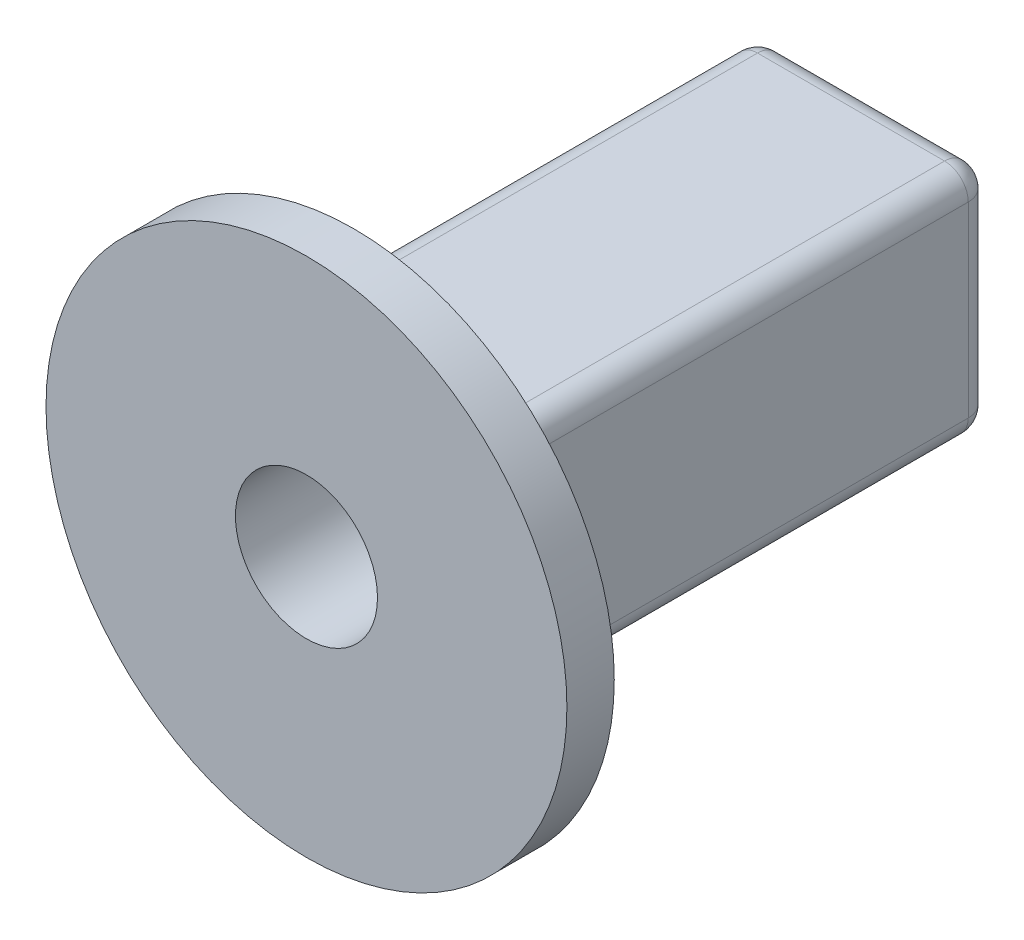
ISO-10303-21;
HEADER;
FILE_DESCRIPTION(('STEP AP214'),'2;1');
FILE_NAME('part.step','',(''),(''),'','','');
FILE_SCHEMA(('AUTOMOTIVE_DESIGN { 1 0 10303 214 1 1 1 1 }'));
ENDSEC;
DATA;
#1=APPLICATION_CONTEXT('core data for automotive mechanical design processes');
#2=APPLICATION_PROTOCOL_DEFINITION('international standard','automotive_design',2000,#1);
#3=PRODUCT_CONTEXT('',#1,'mechanical');
#4=PRODUCT('Part','Part','',(#3));
#5=PRODUCT_RELATED_PRODUCT_CATEGORY('part','',(#4));
#6=PRODUCT_DEFINITION_FORMATION('','',#4);
#7=PRODUCT_DEFINITION_CONTEXT('part definition',#1,'design');
#8=PRODUCT_DEFINITION('design','',#6,#7);
#9=PRODUCT_DEFINITION_SHAPE('','',#8);
#10=(LENGTH_UNIT() NAMED_UNIT(*) SI_UNIT(.MILLI.,.METRE.));
#11=(NAMED_UNIT(*) PLANE_ANGLE_UNIT() SI_UNIT($,.RADIAN.));
#12=(NAMED_UNIT(*) SI_UNIT($,.STERADIAN.) SOLID_ANGLE_UNIT());
#13=UNCERTAINTY_MEASURE_WITH_UNIT(LENGTH_MEASURE(1.E-05),#10,'distance_accuracy_value','');
#14=(GEOMETRIC_REPRESENTATION_CONTEXT(3) GLOBAL_UNCERTAINTY_ASSIGNED_CONTEXT((#13)) GLOBAL_UNIT_ASSIGNED_CONTEXT((#10,
#11,#12)) REPRESENTATION_CONTEXT('',''));
#15=CARTESIAN_POINT('',(0.,0.,0.));
#16=DIRECTION('',(0.,0.,1.));
#17=DIRECTION('',(1.,0.,0.));
#18=AXIS2_PLACEMENT_3D('',#15,#16,#17);
#19=CARTESIAN_POINT('',(-2.47487373415292,2.4748737341529,11.));
#20=DIRECTION('',(1.,0.,0.));
#21=DIRECTION('',(0.,1.,0.));
#22=AXIS2_PLACEMENT_3D('',#19,#20,#21);
#23=PLANE('',#22);
#24=DIRECTION('',(0.,-1.,0.));
#25=VECTOR('',#24,1.);
#26=CARTESIAN_POINT('',(-2.47487373415292,2.4748737341529,0.5));
#27=LINE('',#26,#25);
#28=CARTESIAN_POINT('',(-2.47487373415292,1.9748737341529,0.5));
#29=VERTEX_POINT('',#28);
#30=CARTESIAN_POINT('',(-2.47487373415292,-1.97487373415294,0.5));
#31=VERTEX_POINT('',#30);
#32=EDGE_CURVE('E47',#29,#31,#27,.T.);
#33=ORIENTED_EDGE('',*,*,#32,.T.);
#34=DIRECTION('',(0.,0.,-1.));
#35=VECTOR('',#34,1.);
#36=CARTESIAN_POINT('',(-2.47487373415292,-1.97487373415294,11.));
#37=LINE('',#36,#35);
#38=CARTESIAN_POINT('',(-2.47487373415292,-1.97487373415294,11.));
#39=VERTEX_POINT('',#38);
#40=EDGE_CURVE('E119',#31,#39,#37,.F.);
#41=ORIENTED_EDGE('',*,*,#40,.T.);
#42=DIRECTION('',(0.,-1.,0.));
#43=VECTOR('',#42,1.);
#44=CARTESIAN_POINT('',(-2.47487373415292,2.4748737341529,11.));
#45=LINE('',#44,#43);
#46=CARTESIAN_POINT('',(-2.47487373415292,1.9748737341529,11.));
#47=VERTEX_POINT('',#46);
#48=EDGE_CURVE('E210',#47,#39,#45,.T.);
#49=ORIENTED_EDGE('',*,*,#48,.F.);
#50=DIRECTION('',(0.,0.,-1.));
#51=VECTOR('',#50,1.);
#52=CARTESIAN_POINT('',(-2.47487373415292,1.9748737341529,11.));
#53=LINE('',#52,#51);
#54=EDGE_CURVE('E52',#47,#29,#53,.T.);
#55=ORIENTED_EDGE('',*,*,#54,.T.);
#56=EDGE_LOOP('',(#33,#41,#49,#55));
#57=FACE_BOUND('',#56,.T.);
#58=ADVANCED_FACE('F30',(#57),#23,.F.);
#59=CARTESIAN_POINT('',(-2.47487373415292,-2.47487373415294,11.));
#60=DIRECTION('',(0.,1.,0.));
#61=DIRECTION('',(0.,0.,1.));
#62=AXIS2_PLACEMENT_3D('',#59,#60,#61);
#63=PLANE('',#62);
#64=DIRECTION('',(1.,0.,0.));
#65=VECTOR('',#64,1.);
#66=CARTESIAN_POINT('',(-2.47487373415292,-2.47487373415294,11.));
#67=LINE('',#66,#65);
#68=CARTESIAN_POINT('',(-1.97487373415292,-2.47487373415294,11.));
#69=VERTEX_POINT('',#68);
#70=CARTESIAN_POINT('',(1.97487373415292,-2.47487373415294,11.));
#71=VERTEX_POINT('',#70);
#72=EDGE_CURVE('E215',#69,#71,#67,.T.);
#73=ORIENTED_EDGE('',*,*,#72,.F.);
#74=DIRECTION('',(0.,0.,-1.));
#75=VECTOR('',#74,1.);
#76=CARTESIAN_POINT('',(-1.97487373415292,-2.47487373415294,11.));
#77=LINE('',#76,#75);
#78=CARTESIAN_POINT('',(-1.97487373415292,-2.47487373415294,0.5));
#79=VERTEX_POINT('',#78);
#80=EDGE_CURVE('E156',#69,#79,#77,.T.);
#81=ORIENTED_EDGE('',*,*,#80,.T.);
#82=DIRECTION('',(1.,0.,0.));
#83=VECTOR('',#82,1.);
#84=CARTESIAN_POINT('',(-2.47487373415292,-2.47487373415294,0.5));
#85=LINE('',#84,#83);
#86=CARTESIAN_POINT('',(1.97487373415292,-2.47487373415294,0.5));
#87=VERTEX_POINT('',#86);
#88=EDGE_CURVE('E154',#79,#87,#85,.T.);
#89=ORIENTED_EDGE('',*,*,#88,.T.);
#90=DIRECTION('',(0.,0.,-1.));
#91=VECTOR('',#90,1.);
#92=CARTESIAN_POINT('',(1.97487373415292,-2.47487373415294,11.));
#93=LINE('',#92,#91);
#94=EDGE_CURVE('E152',#87,#71,#93,.F.);
#95=ORIENTED_EDGE('',*,*,#94,.T.);
#96=EDGE_LOOP('',(#73,#81,#89,#95));
#97=FACE_BOUND('',#96,.T.);
#98=ADVANCED_FACE('F267',(#97),#63,.F.);
#99=CARTESIAN_POINT('',(2.47487373415292,2.4748737341529,11.));
#100=DIRECTION('',(-1.,0.,0.));
#101=DIRECTION('',(0.,-1.,0.));
#102=AXIS2_PLACEMENT_3D('',#99,#100,#101);
#103=PLANE('',#102);
#104=DIRECTION('',(0.,1.,0.));
#105=VECTOR('',#104,1.);
#106=CARTESIAN_POINT('',(2.47487373415292,2.4748737341529,0.5));
#107=LINE('',#106,#105);
#108=CARTESIAN_POINT('',(2.47487373415292,-1.97487373415294,0.5));
#109=VERTEX_POINT('',#108);
#110=CARTESIAN_POINT('',(2.47487373415292,1.9748737341529,0.5));
#111=VERTEX_POINT('',#110);
#112=EDGE_CURVE('E135',#109,#111,#107,.T.);
#113=ORIENTED_EDGE('',*,*,#112,.T.);
#114=DIRECTION('',(0.,0.,-1.));
#115=VECTOR('',#114,1.);
#116=CARTESIAN_POINT('',(2.47487373415292,1.9748737341529,11.));
#117=LINE('',#116,#115);
#118=CARTESIAN_POINT('',(2.47487373415292,1.9748737341529,11.));
#119=VERTEX_POINT('',#118);
#120=EDGE_CURVE('E141',#111,#119,#117,.F.);
#121=ORIENTED_EDGE('',*,*,#120,.T.);
#122=DIRECTION('',(0.,1.,0.));
#123=VECTOR('',#122,1.);
#124=CARTESIAN_POINT('',(2.47487373415292,2.4748737341529,11.));
#125=LINE('',#124,#123);
#126=CARTESIAN_POINT('',(2.47487373415292,-1.97487373415294,11.));
#127=VERTEX_POINT('',#126);
#128=EDGE_CURVE('E114',#127,#119,#125,.T.);
#129=ORIENTED_EDGE('',*,*,#128,.F.);
#130=DIRECTION('',(0.,0.,-1.));
#131=VECTOR('',#130,1.);
#132=CARTESIAN_POINT('',(2.47487373415292,-1.97487373415294,11.));
#133=LINE('',#132,#131);
#134=EDGE_CURVE('E132',#127,#109,#133,.T.);
#135=ORIENTED_EDGE('',*,*,#134,.T.);
#136=EDGE_LOOP('',(#113,#121,#129,#135));
#137=FACE_BOUND('',#136,.T.);
#138=ADVANCED_FACE('F231',(#137),#103,.F.);
#139=CARTESIAN_POINT('',(-2.47487373415292,2.4748737341529,11.));
#140=DIRECTION('',(0.,-1.,0.));
#141=DIRECTION('',(0.,0.,-1.));
#142=AXIS2_PLACEMENT_3D('',#139,#140,#141);
#143=PLANE('',#142);
#144=DIRECTION('',(-1.,0.,0.));
#145=VECTOR('',#144,1.);
#146=CARTESIAN_POINT('',(-2.47487373415292,2.4748737341529,11.));
#147=LINE('',#146,#145);
#148=CARTESIAN_POINT('',(1.97487373415292,2.4748737341529,11.));
#149=VERTEX_POINT('',#148);
#150=CARTESIAN_POINT('',(-1.97487373415292,2.4748737341529,11.));
#151=VERTEX_POINT('',#150);
#152=EDGE_CURVE('E111',#149,#151,#147,.T.);
#153=ORIENTED_EDGE('',*,*,#152,.F.);
#154=DIRECTION('',(0.,0.,-1.));
#155=VECTOR('',#154,1.);
#156=CARTESIAN_POINT('',(1.97487373415292,2.4748737341529,11.));
#157=LINE('',#156,#155);
#158=CARTESIAN_POINT('',(1.97487373415292,2.4748737341529,0.5));
#159=VERTEX_POINT('',#158);
#160=EDGE_CURVE('E124',#149,#159,#157,.T.);
#161=ORIENTED_EDGE('',*,*,#160,.T.);
#162=DIRECTION('',(-1.,0.,0.));
#163=VECTOR('',#162,1.);
#164=CARTESIAN_POINT('',(-2.47487373415292,2.4748737341529,0.5));
#165=LINE('',#164,#163);
#166=CARTESIAN_POINT('',(-1.97487373415292,2.4748737341529,0.5));
#167=VERTEX_POINT('',#166);
#168=EDGE_CURVE('E133',#159,#167,#165,.T.);
#169=ORIENTED_EDGE('',*,*,#168,.T.);
#170=DIRECTION('',(0.,0.,-1.));
#171=VECTOR('',#170,1.);
#172=CARTESIAN_POINT('',(-1.97487373415292,2.4748737341529,11.));
#173=LINE('',#172,#171);
#174=EDGE_CURVE('E126',#167,#151,#173,.F.);
#175=ORIENTED_EDGE('',*,*,#174,.T.);
#176=EDGE_LOOP('',(#153,#161,#169,#175));
#177=FACE_BOUND('',#176,.T.);
#178=ADVANCED_FACE('F123',(#177),#143,.F.);
#179=CARTESIAN_POINT('',(-2.47487373415292,-2.47487373415294,0.));
#180=DIRECTION('',(0.,0.,1.));
#181=DIRECTION('',(1.,0.,0.));
#182=AXIS2_PLACEMENT_3D('',#179,#180,#181);
#183=PLANE('',#182);
#184=DIRECTION('',(-1.,0.,0.));
#185=VECTOR('',#184,1.);
#186=CARTESIAN_POINT('',(-2.47487373415292,1.9748737341529,0.));
#187=LINE('',#186,#185);
#188=CARTESIAN_POINT('',(-1.97487373415292,1.9748737341529,0.));
#189=VERTEX_POINT('',#188);
#190=CARTESIAN_POINT('',(1.97487373415292,1.9748737341529,0.));
#191=VERTEX_POINT('',#190);
#192=EDGE_CURVE('E147',#189,#191,#187,.F.);
#193=ORIENTED_EDGE('',*,*,#192,.T.);
#194=DIRECTION('',(0.,1.,0.));
#195=VECTOR('',#194,1.);
#196=CARTESIAN_POINT('',(1.97487373415292,-2.47487373415294,0.));
#197=LINE('',#196,#195);
#198=CARTESIAN_POINT('',(1.97487373415292,-1.97487373415294,0.));
#199=VERTEX_POINT('',#198);
#200=EDGE_CURVE('E149',#191,#199,#197,.F.);
#201=ORIENTED_EDGE('',*,*,#200,.T.);
#202=DIRECTION('',(1.,0.,0.));
#203=VECTOR('',#202,1.);
#204=CARTESIAN_POINT('',(-2.47487373415292,-1.97487373415294,0.));
#205=LINE('',#204,#203);
#206=CARTESIAN_POINT('',(-1.97487373415292,-1.97487373415294,0.));
#207=VERTEX_POINT('',#206);
#208=EDGE_CURVE('E145',#199,#207,#205,.F.);
#209=ORIENTED_EDGE('',*,*,#208,.T.);
#210=DIRECTION('',(0.,-1.,0.));
#211=VECTOR('',#210,1.);
#212=CARTESIAN_POINT('',(-1.97487373415292,-2.47487373415294,0.));
#213=LINE('',#212,#211);
#214=EDGE_CURVE('E143',#207,#189,#213,.F.);
#215=ORIENTED_EDGE('',*,*,#214,.T.);
#216=EDGE_LOOP('',(#193,#201,#209,#215));
#217=FACE_BOUND('',#216,.T.);
#218=CARTESIAN_POINT('',(0.,0.,0.));
#219=DIRECTION('',(0.,0.,1.));
#220=DIRECTION('',(1.,0.,0.));
#221=AXIS2_PLACEMENT_3D('',#218,#219,#220);
#222=CIRCLE('',#221,1.5);
#223=CARTESIAN_POINT('',(1.5,0.,0.));
#224=VERTEX_POINT('',#223);
#225=EDGE_CURVE('E199',#224,#224,#222,.T.);
#226=ORIENTED_EDGE('',*,*,#225,.T.);
#227=EDGE_LOOP('',(#226));
#228=FACE_BOUND('',#227,.T.);
#229=ADVANCED_FACE('F250',(#217,#228),#183,.F.);
#230=CARTESIAN_POINT('',(0.,0.,11.));
#231=DIRECTION('',(0.,0.,1.));
#232=DIRECTION('',(1.,0.,0.));
#233=AXIS2_PLACEMENT_3D('',#230,#231,#232);
#234=PLANE('',#233);
#235=CARTESIAN_POINT('',(0.,0.,11.));
#236=DIRECTION('',(0.,0.,1.));
#237=DIRECTION('',(1.,0.,0.));
#238=AXIS2_PLACEMENT_3D('',#235,#236,#237);
#239=CIRCLE('',#238,5.5);
#240=CARTESIAN_POINT('',(5.5,0.,11.));
#241=VERTEX_POINT('',#240);
#242=EDGE_CURVE('E204',#241,#241,#239,.T.);
#243=ORIENTED_EDGE('',*,*,#242,.F.);
#244=EDGE_LOOP('',(#243));
#245=FACE_BOUND('',#244,.T.);
#246=ORIENTED_EDGE('',*,*,#128,.T.);
#247=CARTESIAN_POINT('',(1.97487373415292,1.9748737341529,11.));
#248=DIRECTION('',(0.,0.,1.));
#249=DIRECTION('',(1.,0.,0.));
#250=AXIS2_PLACEMENT_3D('',#247,#248,#249);
#251=CIRCLE('',#250,0.5);
#252=EDGE_CURVE('E108',#119,#149,#251,.T.);
#253=ORIENTED_EDGE('',*,*,#252,.T.);
#254=ORIENTED_EDGE('',*,*,#152,.T.);
#255=CARTESIAN_POINT('',(-1.97487373415292,1.9748737341529,11.));
#256=DIRECTION('',(0.,0.,1.));
#257=DIRECTION('',(1.,0.,0.));
#258=AXIS2_PLACEMENT_3D('',#255,#256,#257);
#259=CIRCLE('',#258,0.5);
#260=EDGE_CURVE('E11',#151,#47,#259,.T.);
#261=ORIENTED_EDGE('',*,*,#260,.T.);
#262=ORIENTED_EDGE('',*,*,#48,.T.);
#263=CARTESIAN_POINT('',(-1.97487373415292,-1.97487373415294,11.));
#264=DIRECTION('',(0.,0.,1.));
#265=DIRECTION('',(1.,0.,0.));
#266=AXIS2_PLACEMENT_3D('',#263,#264,#265);
#267=CIRCLE('',#266,0.5);
#268=EDGE_CURVE('E118',#39,#69,#267,.T.);
#269=ORIENTED_EDGE('',*,*,#268,.T.);
#270=ORIENTED_EDGE('',*,*,#72,.T.);
#271=CARTESIAN_POINT('',(1.97487373415292,-1.97487373415294,11.));
#272=DIRECTION('',(0.,0.,1.));
#273=DIRECTION('',(1.,0.,0.));
#274=AXIS2_PLACEMENT_3D('',#271,#272,#273);
#275=CIRCLE('',#274,0.5);
#276=EDGE_CURVE('E39',#71,#127,#275,.T.);
#277=ORIENTED_EDGE('',*,*,#276,.T.);
#278=EDGE_LOOP('',(#246,#253,#254,#261,#262,#269,#270,#277));
#279=FACE_BOUND('',#278,.T.);
#280=ADVANCED_FACE('F110',(#245,#279),#234,.F.);
#281=CARTESIAN_POINT('',(0.,0.,12.));
#282=DIRECTION('',(0.,0.,-1.));
#283=DIRECTION('',(-1.,0.,0.));
#284=AXIS2_PLACEMENT_3D('',#281,#282,#283);
#285=CYLINDRICAL_SURFACE('',#284,5.5);
#286=CARTESIAN_POINT('',(0.,0.,12.));
#287=DIRECTION('',(0.,0.,1.));
#288=DIRECTION('',(1.,0.,0.));
#289=AXIS2_PLACEMENT_3D('',#286,#287,#288);
#290=CIRCLE('',#289,5.5);
#291=CARTESIAN_POINT('',(5.5,0.,12.));
#292=VERTEX_POINT('',#291);
#293=EDGE_CURVE('E207',#292,#292,#290,.T.);
#294=ORIENTED_EDGE('',*,*,#293,.F.);
#295=EDGE_LOOP('',(#294));
#296=FACE_BOUND('',#295,.T.);
#297=ORIENTED_EDGE('',*,*,#242,.T.);
#298=EDGE_LOOP('',(#297));
#299=FACE_BOUND('',#298,.T.);
#300=ADVANCED_FACE('F381',(#296,#299),#285,.T.);
#301=CARTESIAN_POINT('',(0.,0.,12.));
#302=DIRECTION('',(0.,0.,1.));
#303=DIRECTION('',(1.,0.,0.));
#304=AXIS2_PLACEMENT_3D('',#301,#302,#303);
#305=PLANE('',#304);
#306=CARTESIAN_POINT('',(0.,0.,12.));
#307=DIRECTION('',(0.,0.,1.));
#308=DIRECTION('',(1.,0.,0.));
#309=AXIS2_PLACEMENT_3D('',#306,#307,#308);
#310=CIRCLE('',#309,1.5);
#311=CARTESIAN_POINT('',(1.5,0.,12.));
#312=VERTEX_POINT('',#311);
#313=EDGE_CURVE('E194',#312,#312,#310,.T.);
#314=ORIENTED_EDGE('',*,*,#313,.F.);
#315=EDGE_LOOP('',(#314));
#316=FACE_BOUND('',#315,.T.);
#317=ORIENTED_EDGE('',*,*,#293,.T.);
#318=EDGE_LOOP('',(#317));
#319=FACE_BOUND('',#318,.T.);
#320=ADVANCED_FACE('F372',(#316,#319),#305,.T.);
#321=CARTESIAN_POINT('',(0.,0.,0.));
#322=DIRECTION('',(0.,0.,1.));
#323=DIRECTION('',(1.,0.,0.));
#324=AXIS2_PLACEMENT_3D('',#321,#322,#323);
#325=CYLINDRICAL_SURFACE('',#324,1.5);
#326=ORIENTED_EDGE('',*,*,#225,.F.);
#327=EDGE_LOOP('',(#326));
#328=FACE_BOUND('',#327,.T.);
#329=ORIENTED_EDGE('',*,*,#313,.T.);
#330=EDGE_LOOP('',(#329));
#331=FACE_BOUND('',#330,.T.);
#332=ADVANCED_FACE('F264',(#328,#331),#325,.F.);
#333=CARTESIAN_POINT('',(-1.97487373415292,-1.97487373415294,11.));
#334=DIRECTION('',(0.,0.,-1.));
#335=DIRECTION('',(-1.,0.,0.));
#336=AXIS2_PLACEMENT_3D('',#333,#334,#335);
#337=CYLINDRICAL_SURFACE('',#336,0.5);
#338=CARTESIAN_POINT('',(-1.97487373415292,-1.97487373415294,0.5));
#339=DIRECTION('',(0.,0.,-1.));
#340=DIRECTION('',(-1.,0.,0.));
#341=AXIS2_PLACEMENT_3D('',#338,#339,#340);
#342=CIRCLE('',#341,0.5);
#343=EDGE_CURVE('E34',#79,#31,#342,.T.);
#344=ORIENTED_EDGE('',*,*,#343,.F.);
#345=ORIENTED_EDGE('',*,*,#80,.F.);
#346=ORIENTED_EDGE('',*,*,#268,.F.);
#347=ORIENTED_EDGE('',*,*,#40,.F.);
#348=EDGE_LOOP('',(#344,#345,#346,#347));
#349=FACE_BOUND('',#348,.T.);
#350=ADVANCED_FACE('F32',(#349),#337,.T.);
#351=CARTESIAN_POINT('',(-1.97487373415292,-1.97487373415294,0.5));
#352=DIRECTION('',(0.,0.,1.));
#353=DIRECTION('',(1.,0.,0.));
#354=AXIS2_PLACEMENT_3D('',#351,#352,#353);
#355=SPHERICAL_SURFACE('',#354,0.5);
#356=CARTESIAN_POINT('',(-1.97487373415292,-1.97487373415294,0.5));
#357=DIRECTION('',(-1.,0.,0.));
#358=DIRECTION('',(0.,0.,1.));
#359=AXIS2_PLACEMENT_3D('',#356,#357,#358);
#360=CIRCLE('',#359,0.5);
#361=EDGE_CURVE('E186',#79,#207,#360,.F.);
#362=ORIENTED_EDGE('',*,*,#361,.F.);
#363=ORIENTED_EDGE('',*,*,#343,.T.);
#364=CARTESIAN_POINT('',(-1.97487373415292,-1.97487373415294,0.5));
#365=DIRECTION('',(0.,-1.,0.));
#366=DIRECTION('',(0.,0.,-1.));
#367=AXIS2_PLACEMENT_3D('',#364,#365,#366);
#368=CIRCLE('',#367,0.5);
#369=EDGE_CURVE('E188',#207,#31,#368,.F.);
#370=ORIENTED_EDGE('',*,*,#369,.F.);
#371=EDGE_LOOP('',(#362,#363,#370));
#372=FACE_BOUND('',#371,.T.);
#373=ADVANCED_FACE('F257',(#372),#355,.T.);
#374=CARTESIAN_POINT('',(-1.97487373415292,1.9748737341529,11.));
#375=DIRECTION('',(0.,0.,-1.));
#376=DIRECTION('',(-1.,0.,0.));
#377=AXIS2_PLACEMENT_3D('',#374,#375,#376);
#378=CYLINDRICAL_SURFACE('',#377,0.5);
#379=ORIENTED_EDGE('',*,*,#260,.F.);
#380=ORIENTED_EDGE('',*,*,#174,.F.);
#381=CARTESIAN_POINT('',(-1.97487373415292,1.9748737341529,0.5));
#382=DIRECTION('',(0.,0.,-1.));
#383=DIRECTION('',(-1.,0.,0.));
#384=AXIS2_PLACEMENT_3D('',#381,#382,#383);
#385=CIRCLE('',#384,0.5);
#386=EDGE_CURVE('E183',#29,#167,#385,.T.);
#387=ORIENTED_EDGE('',*,*,#386,.F.);
#388=ORIENTED_EDGE('',*,*,#54,.F.);
#389=EDGE_LOOP('',(#379,#380,#387,#388));
#390=FACE_BOUND('',#389,.T.);
#391=ADVANCED_FACE('F244',(#390),#378,.T.);
#392=CARTESIAN_POINT('',(-1.97487373415292,2.4748737341529,0.5));
#393=DIRECTION('',(0.,-1.,0.));
#394=DIRECTION('',(1.,0.,0.));
#395=AXIS2_PLACEMENT_3D('',#392,#393,#394);
#396=CYLINDRICAL_SURFACE('',#395,0.5);
#397=ORIENTED_EDGE('',*,*,#369,.T.);
#398=ORIENTED_EDGE('',*,*,#32,.F.);
#399=CARTESIAN_POINT('',(-1.97487373415292,1.9748737341529,0.5));
#400=DIRECTION('',(0.,1.,0.));
#401=DIRECTION('',(0.,0.,1.));
#402=AXIS2_PLACEMENT_3D('',#399,#400,#401);
#403=CIRCLE('',#402,0.5);
#404=EDGE_CURVE('E180',#189,#29,#403,.T.);
#405=ORIENTED_EDGE('',*,*,#404,.F.);
#406=ORIENTED_EDGE('',*,*,#214,.F.);
#407=EDGE_LOOP('',(#397,#398,#405,#406));
#408=FACE_BOUND('',#407,.T.);
#409=ADVANCED_FACE('F248',(#408),#396,.T.);
#410=CARTESIAN_POINT('',(-2.47487373415292,-1.97487373415294,0.5));
#411=DIRECTION('',(1.,0.,0.));
#412=DIRECTION('',(0.,0.,-1.));
#413=AXIS2_PLACEMENT_3D('',#410,#411,#412);
#414=CYLINDRICAL_SURFACE('',#413,0.5);
#415=ORIENTED_EDGE('',*,*,#361,.T.);
#416=ORIENTED_EDGE('',*,*,#208,.F.);
#417=CARTESIAN_POINT('',(1.97487373415292,-1.97487373415294,0.5));
#418=DIRECTION('',(1.,0.,0.));
#419=DIRECTION('',(0.,0.,-1.));
#420=AXIS2_PLACEMENT_3D('',#417,#418,#419);
#421=CIRCLE('',#420,0.5);
#422=EDGE_CURVE('E177',#87,#199,#421,.T.);
#423=ORIENTED_EDGE('',*,*,#422,.F.);
#424=ORIENTED_EDGE('',*,*,#88,.F.);
#425=EDGE_LOOP('',(#415,#416,#423,#424));
#426=FACE_BOUND('',#425,.T.);
#427=ADVANCED_FACE('F256',(#426),#414,.T.);
#428=CARTESIAN_POINT('',(1.97487373415292,-1.97487373415294,11.));
#429=DIRECTION('',(0.,0.,-1.));
#430=DIRECTION('',(-1.,0.,0.));
#431=AXIS2_PLACEMENT_3D('',#428,#429,#430);
#432=CYLINDRICAL_SURFACE('',#431,0.5);
#433=ORIENTED_EDGE('',*,*,#276,.F.);
#434=ORIENTED_EDGE('',*,*,#94,.F.);
#435=CARTESIAN_POINT('',(1.97487373415292,-1.97487373415294,0.5));
#436=DIRECTION('',(0.,0.,-1.));
#437=DIRECTION('',(-1.,0.,0.));
#438=AXIS2_PLACEMENT_3D('',#435,#436,#437);
#439=CIRCLE('',#438,0.5);
#440=EDGE_CURVE('E174',#109,#87,#439,.T.);
#441=ORIENTED_EDGE('',*,*,#440,.F.);
#442=ORIENTED_EDGE('',*,*,#134,.F.);
#443=EDGE_LOOP('',(#433,#434,#441,#442));
#444=FACE_BOUND('',#443,.T.);
#445=ADVANCED_FACE('F226',(#444),#432,.T.);
#446=CARTESIAN_POINT('',(-1.97487373415292,1.9748737341529,0.5));
#447=DIRECTION('',(0.,0.,1.));
#448=DIRECTION('',(1.,0.,0.));
#449=AXIS2_PLACEMENT_3D('',#446,#447,#448);
#450=SPHERICAL_SURFACE('',#449,0.5);
#451=ORIENTED_EDGE('',*,*,#404,.T.);
#452=ORIENTED_EDGE('',*,*,#386,.T.);
#453=CARTESIAN_POINT('',(-1.97487373415292,1.9748737341529,0.5));
#454=DIRECTION('',(-1.,0.,0.));
#455=DIRECTION('',(0.,0.,1.));
#456=AXIS2_PLACEMENT_3D('',#453,#454,#455);
#457=CIRCLE('',#456,0.5);
#458=EDGE_CURVE('E171',#189,#167,#457,.F.);
#459=ORIENTED_EDGE('',*,*,#458,.F.);
#460=EDGE_LOOP('',(#451,#452,#459));
#461=FACE_BOUND('',#460,.T.);
#462=ADVANCED_FACE('F246',(#461),#450,.T.);
#463=CARTESIAN_POINT('',(1.97487373415292,-1.97487373415294,0.5));
#464=DIRECTION('',(0.,0.,1.));
#465=DIRECTION('',(1.,0.,0.));
#466=AXIS2_PLACEMENT_3D('',#463,#464,#465);
#467=SPHERICAL_SURFACE('',#466,0.5);
#468=ORIENTED_EDGE('',*,*,#440,.T.);
#469=ORIENTED_EDGE('',*,*,#422,.T.);
#470=CARTESIAN_POINT('',(1.97487373415292,-1.97487373415294,0.5));
#471=DIRECTION('',(0.,-1.,0.));
#472=DIRECTION('',(1.,0.,0.));
#473=AXIS2_PLACEMENT_3D('',#470,#471,#472);
#474=CIRCLE('',#473,0.5);
#475=EDGE_CURVE('E169',#109,#199,#474,.F.);
#476=ORIENTED_EDGE('',*,*,#475,.F.);
#477=EDGE_LOOP('',(#468,#469,#476));
#478=FACE_BOUND('',#477,.T.);
#479=ADVANCED_FACE('F285',(#478),#467,.T.);
#480=CARTESIAN_POINT('',(-2.47487373415292,1.9748737341529,0.5));
#481=DIRECTION('',(-1.,0.,0.));
#482=DIRECTION('',(0.,0.,1.));
#483=AXIS2_PLACEMENT_3D('',#480,#481,#482);
#484=CYLINDRICAL_SURFACE('',#483,0.5);
#485=ORIENTED_EDGE('',*,*,#458,.T.);
#486=ORIENTED_EDGE('',*,*,#168,.F.);
#487=CARTESIAN_POINT('',(1.97487373415292,1.9748737341529,0.5));
#488=DIRECTION('',(1.,0.,0.));
#489=DIRECTION('',(0.,1.,0.));
#490=AXIS2_PLACEMENT_3D('',#487,#488,#489);
#491=CIRCLE('',#490,0.5);
#492=EDGE_CURVE('E167',#191,#159,#491,.T.);
#493=ORIENTED_EDGE('',*,*,#492,.F.);
#494=ORIENTED_EDGE('',*,*,#192,.F.);
#495=EDGE_LOOP('',(#485,#486,#493,#494));
#496=FACE_BOUND('',#495,.T.);
#497=ADVANCED_FACE('F240',(#496),#484,.T.);
#498=CARTESIAN_POINT('',(1.97487373415292,2.4748737341529,0.5));
#499=DIRECTION('',(0.,1.,0.));
#500=DIRECTION('',(-1.,0.,0.));
#501=AXIS2_PLACEMENT_3D('',#498,#499,#500);
#502=CYLINDRICAL_SURFACE('',#501,0.5);
#503=ORIENTED_EDGE('',*,*,#475,.T.);
#504=ORIENTED_EDGE('',*,*,#200,.F.);
#505=CARTESIAN_POINT('',(1.97487373415292,1.9748737341529,0.5));
#506=DIRECTION('',(0.,1.,0.));
#507=DIRECTION('',(0.,0.,1.));
#508=AXIS2_PLACEMENT_3D('',#505,#506,#507);
#509=CIRCLE('',#508,0.5);
#510=EDGE_CURVE('E164',#111,#191,#509,.T.);
#511=ORIENTED_EDGE('',*,*,#510,.F.);
#512=ORIENTED_EDGE('',*,*,#112,.F.);
#513=EDGE_LOOP('',(#503,#504,#511,#512));
#514=FACE_BOUND('',#513,.T.);
#515=ADVANCED_FACE('F279',(#514),#502,.T.);
#516=CARTESIAN_POINT('',(1.97487373415292,1.9748737341529,0.5));
#517=DIRECTION('',(0.,0.,1.));
#518=DIRECTION('',(1.,0.,0.));
#519=AXIS2_PLACEMENT_3D('',#516,#517,#518);
#520=SPHERICAL_SURFACE('',#519,0.5);
#521=ORIENTED_EDGE('',*,*,#510,.T.);
#522=ORIENTED_EDGE('',*,*,#492,.T.);
#523=CARTESIAN_POINT('',(1.97487373415292,1.9748737341529,0.5));
#524=DIRECTION('',(0.,0.,-1.));
#525=DIRECTION('',(-1.,0.,0.));
#526=AXIS2_PLACEMENT_3D('',#523,#524,#525);
#527=CIRCLE('',#526,0.5);
#528=EDGE_CURVE('E130',#111,#159,#527,.F.);
#529=ORIENTED_EDGE('',*,*,#528,.F.);
#530=EDGE_LOOP('',(#521,#522,#529));
#531=FACE_BOUND('',#530,.T.);
#532=ADVANCED_FACE('F235',(#531),#520,.T.);
#533=CARTESIAN_POINT('',(1.97487373415292,1.9748737341529,11.));
#534=DIRECTION('',(0.,0.,-1.));
#535=DIRECTION('',(-1.,0.,0.));
#536=AXIS2_PLACEMENT_3D('',#533,#534,#535);
#537=CYLINDRICAL_SURFACE('',#536,0.5);
#538=ORIENTED_EDGE('',*,*,#252,.F.);
#539=ORIENTED_EDGE('',*,*,#120,.F.);
#540=ORIENTED_EDGE('',*,*,#528,.T.);
#541=ORIENTED_EDGE('',*,*,#160,.F.);
#542=EDGE_LOOP('',(#538,#539,#540,#541));
#543=FACE_BOUND('',#542,.T.);
#544=ADVANCED_FACE('F128',(#543),#537,.T.);
#545=CLOSED_SHELL('',(#58,#98,#138,#178,#229,#280,#300,#320,#332,#350,#373,#391,#409,#427,#445,
#462,#479,#497,#515,#532,#544));
#546=MANIFOLD_SOLID_BREP('B2',#545);
#547=ADVANCED_BREP_SHAPE_REPRESENTATION('',(#18,#546),#14);
#548=SHAPE_DEFINITION_REPRESENTATION(#9,#547);
ENDSEC;
END-ISO-10303-21;
